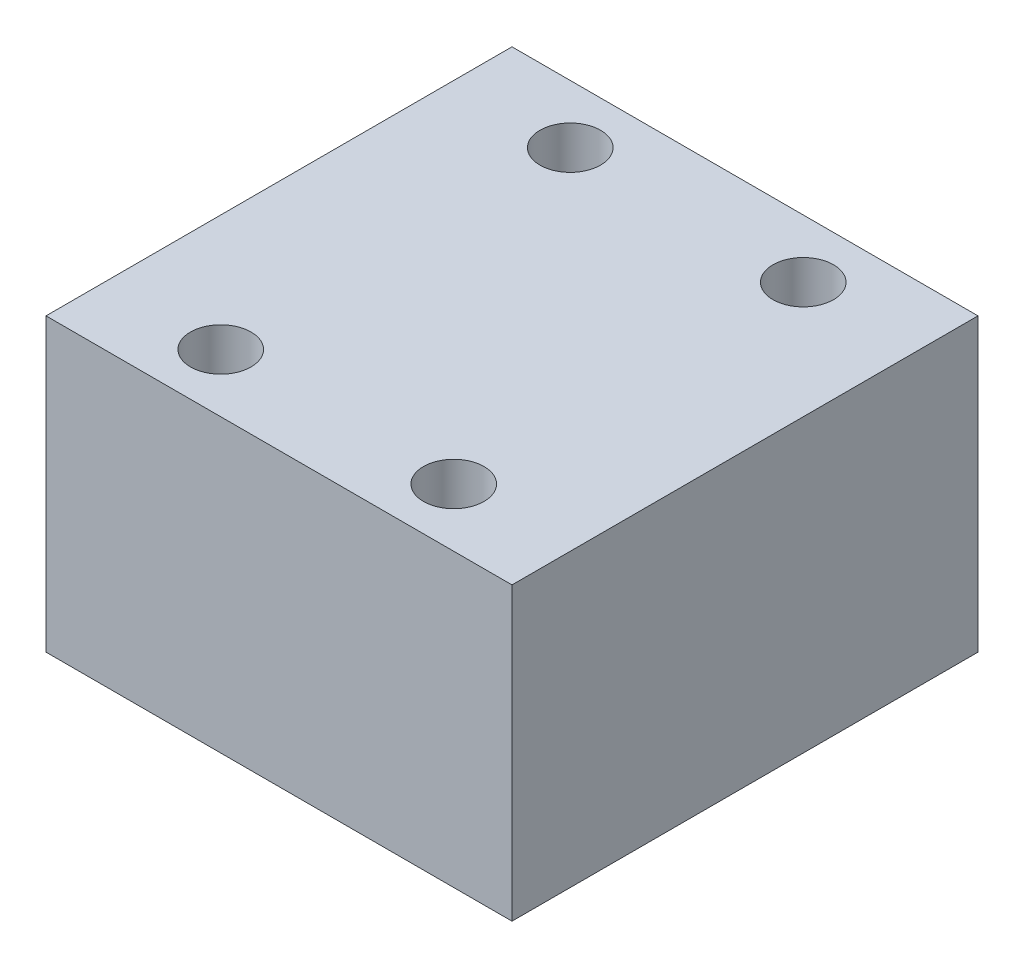
ISO-10303-21;
HEADER;
FILE_DESCRIPTION(('STEP AP214'),'2;1');
FILE_NAME('part.step','',(''),(''),'','','');
FILE_SCHEMA(('AUTOMOTIVE_DESIGN { 1 0 10303 214 1 1 1 1 }'));
ENDSEC;
DATA;
#1=APPLICATION_CONTEXT('core data for automotive mechanical design processes');
#2=APPLICATION_PROTOCOL_DEFINITION('international standard','automotive_design',2000,#1);
#3=PRODUCT_CONTEXT('',#1,'mechanical');
#4=PRODUCT('Part','Part','',(#3));
#5=PRODUCT_RELATED_PRODUCT_CATEGORY('part','',(#4));
#6=PRODUCT_DEFINITION_FORMATION('','',#4);
#7=PRODUCT_DEFINITION_CONTEXT('part definition',#1,'design');
#8=PRODUCT_DEFINITION('design','',#6,#7);
#9=PRODUCT_DEFINITION_SHAPE('','',#8);
#10=(LENGTH_UNIT() NAMED_UNIT(*) SI_UNIT(.MILLI.,.METRE.));
#11=(NAMED_UNIT(*) PLANE_ANGLE_UNIT() SI_UNIT($,.RADIAN.));
#12=(NAMED_UNIT(*) SI_UNIT($,.STERADIAN.) SOLID_ANGLE_UNIT());
#13=UNCERTAINTY_MEASURE_WITH_UNIT(LENGTH_MEASURE(1.E-05),#10,'distance_accuracy_value','');
#14=(GEOMETRIC_REPRESENTATION_CONTEXT(3) GLOBAL_UNCERTAINTY_ASSIGNED_CONTEXT((#13)) GLOBAL_UNIT_ASSIGNED_CONTEXT((#10,
#11,#12)) REPRESENTATION_CONTEXT('',''));
#15=CARTESIAN_POINT('',(0.,0.,0.));
#16=DIRECTION('',(0.,0.,1.));
#17=DIRECTION('',(1.,0.,0.));
#18=AXIS2_PLACEMENT_3D('',#15,#16,#17);
#19=CARTESIAN_POINT('',(20.,-12.5,-20.));
#20=DIRECTION('',(1.,0.,0.));
#21=DIRECTION('',(0.,0.,-1.));
#22=AXIS2_PLACEMENT_3D('',#19,#20,#21);
#23=PLANE('',#22);
#24=DIRECTION('',(0.,1.,0.));
#25=VECTOR('',#24,1.);
#26=CARTESIAN_POINT('',(20.,-12.5,-20.));
#27=LINE('',#26,#25);
#28=CARTESIAN_POINT('',(20.,-12.5,-20.));
#29=VERTEX_POINT('',#28);
#30=CARTESIAN_POINT('',(20.,12.5,-20.));
#31=VERTEX_POINT('',#30);
#32=EDGE_CURVE('E36',#29,#31,#27,.T.);
#33=ORIENTED_EDGE('',*,*,#32,.T.);
#34=DIRECTION('',(0.,0.,-1.));
#35=VECTOR('',#34,1.);
#36=CARTESIAN_POINT('',(20.,12.5,-20.));
#37=LINE('',#36,#35);
#38=CARTESIAN_POINT('',(20.,12.5,20.));
#39=VERTEX_POINT('',#38);
#40=EDGE_CURVE('E73',#39,#31,#37,.T.);
#41=ORIENTED_EDGE('',*,*,#40,.F.);
#42=DIRECTION('',(0.,1.,0.));
#43=VECTOR('',#42,1.);
#44=CARTESIAN_POINT('',(20.,-12.5,20.));
#45=LINE('',#44,#43);
#46=CARTESIAN_POINT('',(20.,-12.5,20.));
#47=VERTEX_POINT('',#46);
#48=EDGE_CURVE('E11',#47,#39,#45,.T.);
#49=ORIENTED_EDGE('',*,*,#48,.F.);
#50=DIRECTION('',(0.,0.,-1.));
#51=VECTOR('',#50,1.);
#52=CARTESIAN_POINT('',(20.,-12.5,-20.));
#53=LINE('',#52,#51);
#54=EDGE_CURVE('E74',#47,#29,#53,.T.);
#55=ORIENTED_EDGE('',*,*,#54,.T.);
#56=EDGE_LOOP('',(#33,#41,#49,#55));
#57=FACE_BOUND('',#56,.T.);
#58=ADVANCED_FACE('F33',(#57),#23,.T.);
#59=CARTESIAN_POINT('',(-20.,-12.5,20.));
#60=DIRECTION('',(0.,0.,1.));
#61=DIRECTION('',(1.,0.,0.));
#62=AXIS2_PLACEMENT_3D('',#59,#60,#61);
#63=PLANE('',#62);
#64=ORIENTED_EDGE('',*,*,#48,.T.);
#65=DIRECTION('',(1.,0.,0.));
#66=VECTOR('',#65,1.);
#67=CARTESIAN_POINT('',(-20.,12.5,20.));
#68=LINE('',#67,#66);
#69=CARTESIAN_POINT('',(-20.,12.5,20.));
#70=VERTEX_POINT('',#69);
#71=EDGE_CURVE('E90',#70,#39,#68,.T.);
#72=ORIENTED_EDGE('',*,*,#71,.F.);
#73=DIRECTION('',(0.,1.,0.));
#74=VECTOR('',#73,1.);
#75=CARTESIAN_POINT('',(-20.,-12.5,20.));
#76=LINE('',#75,#74);
#77=CARTESIAN_POINT('',(-20.,-12.5,20.));
#78=VERTEX_POINT('',#77);
#79=EDGE_CURVE('E41',#78,#70,#76,.T.);
#80=ORIENTED_EDGE('',*,*,#79,.F.);
#81=DIRECTION('',(1.,0.,0.));
#82=VECTOR('',#81,1.);
#83=CARTESIAN_POINT('',(-20.,-12.5,20.));
#84=LINE('',#83,#82);
#85=EDGE_CURVE('E79',#78,#47,#84,.T.);
#86=ORIENTED_EDGE('',*,*,#85,.T.);
#87=EDGE_LOOP('',(#64,#72,#80,#86));
#88=FACE_BOUND('',#87,.T.);
#89=ADVANCED_FACE('F110',(#88),#63,.T.);
#90=CARTESIAN_POINT('',(-20.,-12.5,-20.));
#91=DIRECTION('',(-1.,0.,0.));
#92=DIRECTION('',(0.,0.,1.));
#93=AXIS2_PLACEMENT_3D('',#90,#91,#92);
#94=PLANE('',#93);
#95=ORIENTED_EDGE('',*,*,#79,.T.);
#96=DIRECTION('',(0.,0.,1.));
#97=VECTOR('',#96,1.);
#98=CARTESIAN_POINT('',(-20.,12.5,-20.));
#99=LINE('',#98,#97);
#100=CARTESIAN_POINT('',(-20.,12.5,-20.));
#101=VERTEX_POINT('',#100);
#102=EDGE_CURVE('E86',#101,#70,#99,.T.);
#103=ORIENTED_EDGE('',*,*,#102,.F.);
#104=DIRECTION('',(0.,1.,0.));
#105=VECTOR('',#104,1.);
#106=CARTESIAN_POINT('',(-20.,-12.5,-20.));
#107=LINE('',#106,#105);
#108=CARTESIAN_POINT('',(-20.,-12.5,-20.));
#109=VERTEX_POINT('',#108);
#110=EDGE_CURVE('E78',#109,#101,#107,.T.);
#111=ORIENTED_EDGE('',*,*,#110,.F.);
#112=DIRECTION('',(0.,0.,1.));
#113=VECTOR('',#112,1.);
#114=CARTESIAN_POINT('',(-20.,-12.5,-20.));
#115=LINE('',#114,#113);
#116=EDGE_CURVE('E103',#109,#78,#115,.T.);
#117=ORIENTED_EDGE('',*,*,#116,.T.);
#118=EDGE_LOOP('',(#95,#103,#111,#117));
#119=FACE_BOUND('',#118,.T.);
#120=ADVANCED_FACE('F107',(#119),#94,.T.);
#121=CARTESIAN_POINT('',(-20.,-12.5,-20.));
#122=DIRECTION('',(0.,0.,-1.));
#123=DIRECTION('',(-1.,0.,0.));
#124=AXIS2_PLACEMENT_3D('',#121,#122,#123);
#125=PLANE('',#124);
#126=ORIENTED_EDGE('',*,*,#110,.T.);
#127=DIRECTION('',(-1.,0.,0.));
#128=VECTOR('',#127,1.);
#129=CARTESIAN_POINT('',(-20.,12.5,-20.));
#130=LINE('',#129,#128);
#131=EDGE_CURVE('E81',#31,#101,#130,.T.);
#132=ORIENTED_EDGE('',*,*,#131,.F.);
#133=ORIENTED_EDGE('',*,*,#32,.F.);
#134=DIRECTION('',(-1.,0.,0.));
#135=VECTOR('',#134,1.);
#136=CARTESIAN_POINT('',(-20.,-12.5,-20.));
#137=LINE('',#136,#135);
#138=EDGE_CURVE('E101',#29,#109,#137,.T.);
#139=ORIENTED_EDGE('',*,*,#138,.T.);
#140=EDGE_LOOP('',(#126,#132,#133,#139));
#141=FACE_BOUND('',#140,.T.);
#142=ADVANCED_FACE('F82',(#141),#125,.T.);
#143=CARTESIAN_POINT('',(0.,-12.5,0.));
#144=DIRECTION('',(0.,1.,0.));
#145=DIRECTION('',(0.,0.,1.));
#146=AXIS2_PLACEMENT_3D('',#143,#144,#145);
#147=PLANE('',#146);
#148=CARTESIAN_POINT('',(10.,-12.5,-15.));
#149=DIRECTION('',(0.,1.,0.));
#150=DIRECTION('',(0.,0.,1.));
#151=AXIS2_PLACEMENT_3D('',#148,#149,#150);
#152=CIRCLE('',#151,2.6);
#153=CARTESIAN_POINT('',(10.,-12.5,-12.4));
#154=VERTEX_POINT('',#153);
#155=EDGE_CURVE('E195',#154,#154,#152,.T.);
#156=ORIENTED_EDGE('',*,*,#155,.T.);
#157=EDGE_LOOP('',(#156));
#158=FACE_BOUND('',#157,.T.);
#159=CARTESIAN_POINT('',(-9.99999999999969,-12.5,15.));
#160=DIRECTION('',(0.,1.,0.));
#161=DIRECTION('',(0.,0.,1.));
#162=AXIS2_PLACEMENT_3D('',#159,#160,#161);
#163=CIRCLE('',#162,2.6);
#164=CARTESIAN_POINT('',(-9.99999999999969,-12.5,17.6));
#165=VERTEX_POINT('',#164);
#166=EDGE_CURVE('E199',#165,#165,#163,.T.);
#167=ORIENTED_EDGE('',*,*,#166,.T.);
#168=EDGE_LOOP('',(#167));
#169=FACE_BOUND('',#168,.T.);
#170=CARTESIAN_POINT('',(10.0000000000003,-12.5,15.));
#171=DIRECTION('',(0.,1.,0.));
#172=DIRECTION('',(0.,0.,1.));
#173=AXIS2_PLACEMENT_3D('',#170,#171,#172);
#174=CIRCLE('',#173,2.6);
#175=CARTESIAN_POINT('',(10.0000000000003,-12.5,17.6));
#176=VERTEX_POINT('',#175);
#177=EDGE_CURVE('E208',#176,#176,#174,.T.);
#178=ORIENTED_EDGE('',*,*,#177,.T.);
#179=EDGE_LOOP('',(#178));
#180=FACE_BOUND('',#179,.T.);
#181=CARTESIAN_POINT('',(-10.,-12.5,-15.));
#182=DIRECTION('',(0.,1.,0.));
#183=DIRECTION('',(0.,0.,1.));
#184=AXIS2_PLACEMENT_3D('',#181,#182,#183);
#185=CIRCLE('',#184,2.6);
#186=CARTESIAN_POINT('',(-10.,-12.5,-12.4));
#187=VERTEX_POINT('',#186);
#188=EDGE_CURVE('E91',#187,#187,#185,.T.);
#189=ORIENTED_EDGE('',*,*,#188,.T.);
#190=EDGE_LOOP('',(#189));
#191=FACE_BOUND('',#190,.T.);
#192=ORIENTED_EDGE('',*,*,#54,.F.);
#193=ORIENTED_EDGE('',*,*,#85,.F.);
#194=ORIENTED_EDGE('',*,*,#116,.F.);
#195=ORIENTED_EDGE('',*,*,#138,.F.);
#196=EDGE_LOOP('',(#192,#193,#194,#195));
#197=FACE_BOUND('',#196,.T.);
#198=ADVANCED_FACE('F112',(#158,#169,#180,#191,#197),#147,.F.);
#199=CARTESIAN_POINT('',(0.,12.5,0.));
#200=DIRECTION('',(0.,1.,0.));
#201=DIRECTION('',(0.,0.,1.));
#202=AXIS2_PLACEMENT_3D('',#199,#200,#201);
#203=PLANE('',#202);
#204=CARTESIAN_POINT('',(10.,12.5,-15.));
#205=DIRECTION('',(0.,1.,0.));
#206=DIRECTION('',(0.,0.,1.));
#207=AXIS2_PLACEMENT_3D('',#204,#205,#206);
#208=CIRCLE('',#207,2.6);
#209=CARTESIAN_POINT('',(10.,12.5,-12.4));
#210=VERTEX_POINT('',#209);
#211=EDGE_CURVE('E198',#210,#210,#208,.T.);
#212=ORIENTED_EDGE('',*,*,#211,.F.);
#213=EDGE_LOOP('',(#212));
#214=FACE_BOUND('',#213,.T.);
#215=CARTESIAN_POINT('',(-9.99999999999969,12.5,15.));
#216=DIRECTION('',(0.,1.,0.));
#217=DIRECTION('',(0.,0.,1.));
#218=AXIS2_PLACEMENT_3D('',#215,#216,#217);
#219=CIRCLE('',#218,2.6);
#220=CARTESIAN_POINT('',(-9.99999999999969,12.5,17.6));
#221=VERTEX_POINT('',#220);
#222=EDGE_CURVE('E203',#221,#221,#219,.T.);
#223=ORIENTED_EDGE('',*,*,#222,.F.);
#224=EDGE_LOOP('',(#223));
#225=FACE_BOUND('',#224,.T.);
#226=CARTESIAN_POINT('',(10.0000000000003,12.5,15.));
#227=DIRECTION('',(0.,1.,0.));
#228=DIRECTION('',(0.,0.,1.));
#229=AXIS2_PLACEMENT_3D('',#226,#227,#228);
#230=CIRCLE('',#229,2.6);
#231=CARTESIAN_POINT('',(10.0000000000003,12.5,17.6));
#232=VERTEX_POINT('',#231);
#233=EDGE_CURVE('E212',#232,#232,#230,.T.);
#234=ORIENTED_EDGE('',*,*,#233,.F.);
#235=EDGE_LOOP('',(#234));
#236=FACE_BOUND('',#235,.T.);
#237=CARTESIAN_POINT('',(-10.,12.5,-15.));
#238=DIRECTION('',(0.,1.,0.));
#239=DIRECTION('',(0.,0.,1.));
#240=AXIS2_PLACEMENT_3D('',#237,#238,#239);
#241=CIRCLE('',#240,2.6);
#242=CARTESIAN_POINT('',(-10.,12.5,-12.4));
#243=VERTEX_POINT('',#242);
#244=EDGE_CURVE('E94',#243,#243,#241,.T.);
#245=ORIENTED_EDGE('',*,*,#244,.F.);
#246=EDGE_LOOP('',(#245));
#247=FACE_BOUND('',#246,.T.);
#248=ORIENTED_EDGE('',*,*,#40,.T.);
#249=ORIENTED_EDGE('',*,*,#131,.T.);
#250=ORIENTED_EDGE('',*,*,#102,.T.);
#251=ORIENTED_EDGE('',*,*,#71,.T.);
#252=EDGE_LOOP('',(#248,#249,#250,#251));
#253=FACE_BOUND('',#252,.T.);
#254=ADVANCED_FACE('F89',(#214,#225,#236,#247,#253),#203,.T.);
#255=CARTESIAN_POINT('',(-10.,-12.5,-15.));
#256=DIRECTION('',(0.,1.,0.));
#257=DIRECTION('',(0.,0.,1.));
#258=AXIS2_PLACEMENT_3D('',#255,#256,#257);
#259=CYLINDRICAL_SURFACE('',#258,2.6);
#260=ORIENTED_EDGE('',*,*,#188,.F.);
#261=EDGE_LOOP('',(#260));
#262=FACE_BOUND('',#261,.T.);
#263=ORIENTED_EDGE('',*,*,#244,.T.);
#264=EDGE_LOOP('',(#263));
#265=FACE_BOUND('',#264,.T.);
#266=ADVANCED_FACE('F120',(#262,#265),#259,.F.);
#267=CARTESIAN_POINT('',(10.0000000000003,-12.5,15.));
#268=DIRECTION('',(0.,1.,0.));
#269=DIRECTION('',(0.,0.,1.));
#270=AXIS2_PLACEMENT_3D('',#267,#268,#269);
#271=CYLINDRICAL_SURFACE('',#270,2.6);
#272=ORIENTED_EDGE('',*,*,#177,.F.);
#273=EDGE_LOOP('',(#272));
#274=FACE_BOUND('',#273,.T.);
#275=ORIENTED_EDGE('',*,*,#233,.T.);
#276=EDGE_LOOP('',(#275));
#277=FACE_BOUND('',#276,.T.);
#278=ADVANCED_FACE('F159',(#274,#277),#271,.F.);
#279=CARTESIAN_POINT('',(-9.99999999999969,-12.5,15.));
#280=DIRECTION('',(0.,1.,0.));
#281=DIRECTION('',(0.,0.,1.));
#282=AXIS2_PLACEMENT_3D('',#279,#280,#281);
#283=CYLINDRICAL_SURFACE('',#282,2.6);
#284=ORIENTED_EDGE('',*,*,#166,.F.);
#285=EDGE_LOOP('',(#284));
#286=FACE_BOUND('',#285,.T.);
#287=ORIENTED_EDGE('',*,*,#222,.T.);
#288=EDGE_LOOP('',(#287));
#289=FACE_BOUND('',#288,.T.);
#290=ADVANCED_FACE('F169',(#286,#289),#283,.F.);
#291=CARTESIAN_POINT('',(10.,-12.5,-15.));
#292=DIRECTION('',(0.,1.,0.));
#293=DIRECTION('',(0.,0.,1.));
#294=AXIS2_PLACEMENT_3D('',#291,#292,#293);
#295=CYLINDRICAL_SURFACE('',#294,2.6);
#296=ORIENTED_EDGE('',*,*,#155,.F.);
#297=EDGE_LOOP('',(#296));
#298=FACE_BOUND('',#297,.T.);
#299=ORIENTED_EDGE('',*,*,#211,.T.);
#300=EDGE_LOOP('',(#299));
#301=FACE_BOUND('',#300,.T.);
#302=ADVANCED_FACE('F179',(#298,#301),#295,.F.);
#303=CLOSED_SHELL('',(#58,#89,#120,#142,#198,#254,#266,#278,#290,#302));
#304=MANIFOLD_SOLID_BREP('B2',#303);
#305=ADVANCED_BREP_SHAPE_REPRESENTATION('',(#18,#304),#14);
#306=SHAPE_DEFINITION_REPRESENTATION(#9,#305);
ENDSEC;
END-ISO-10303-21;
